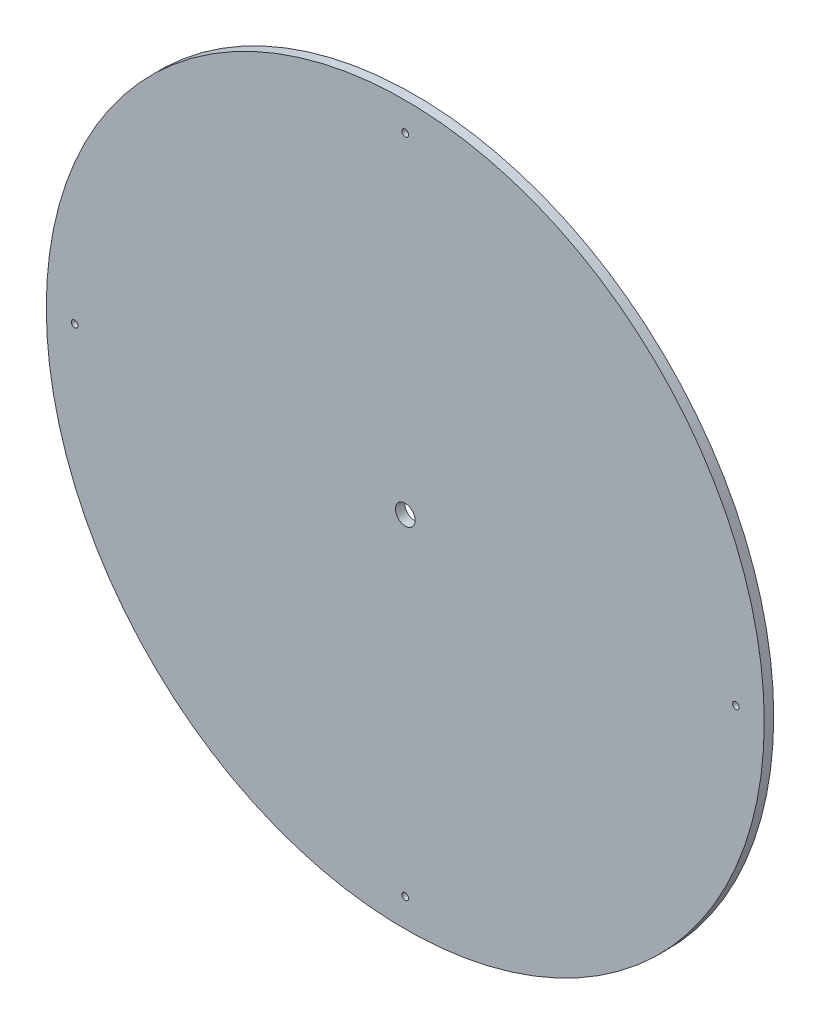
ISO-10303-21;
HEADER;
FILE_DESCRIPTION(('STEP AP214'),'2;1');
FILE_NAME('part.step','',(''),(''),'','','');
FILE_SCHEMA(('AUTOMOTIVE_DESIGN { 1 0 10303 214 1 1 1 1 }'));
ENDSEC;
DATA;
#1=APPLICATION_CONTEXT('core data for automotive mechanical design processes');
#2=APPLICATION_PROTOCOL_DEFINITION('international standard','automotive_design',2000,#1);
#3=PRODUCT_CONTEXT('',#1,'mechanical');
#4=PRODUCT('Part','Part','',(#3));
#5=PRODUCT_RELATED_PRODUCT_CATEGORY('part','',(#4));
#6=PRODUCT_DEFINITION_FORMATION('','',#4);
#7=PRODUCT_DEFINITION_CONTEXT('part definition',#1,'design');
#8=PRODUCT_DEFINITION('design','',#6,#7);
#9=PRODUCT_DEFINITION_SHAPE('','',#8);
#10=(LENGTH_UNIT() NAMED_UNIT(*) SI_UNIT(.MILLI.,.METRE.));
#11=(NAMED_UNIT(*) PLANE_ANGLE_UNIT() SI_UNIT($,.RADIAN.));
#12=(NAMED_UNIT(*) SI_UNIT($,.STERADIAN.) SOLID_ANGLE_UNIT());
#13=UNCERTAINTY_MEASURE_WITH_UNIT(LENGTH_MEASURE(1.E-05),#10,'distance_accuracy_value','');
#14=(GEOMETRIC_REPRESENTATION_CONTEXT(3) GLOBAL_UNCERTAINTY_ASSIGNED_CONTEXT((#13)) GLOBAL_UNIT_ASSIGNED_CONTEXT((#10,
#11,#12)) REPRESENTATION_CONTEXT('',''));
#15=CARTESIAN_POINT('',(0.,0.,0.));
#16=DIRECTION('',(0.,0.,1.));
#17=DIRECTION('',(1.,0.,0.));
#18=AXIS2_PLACEMENT_3D('',#15,#16,#17);
#19=CARTESIAN_POINT('',(0.,0.,12.));
#20=DIRECTION('',(0.,0.,-1.));
#21=DIRECTION('',(-1.,0.,0.));
#22=AXIS2_PLACEMENT_3D('',#19,#20,#21);
#23=CYLINDRICAL_SURFACE('',#22,455.);
#24=CARTESIAN_POINT('',(0.,0.,12.));
#25=DIRECTION('',(0.,0.,1.));
#26=DIRECTION('',(1.,0.,0.));
#27=AXIS2_PLACEMENT_3D('',#24,#25,#26);
#28=CIRCLE('',#27,455.);
#29=CARTESIAN_POINT('',(455.,0.,12.));
#30=VERTEX_POINT('',#29);
#31=EDGE_CURVE('E10',#30,#30,#28,.T.);
#32=ORIENTED_EDGE('',*,*,#31,.F.);
#33=EDGE_LOOP('',(#32));
#34=FACE_BOUND('',#33,.T.);
#35=CARTESIAN_POINT('',(0.,0.,0.));
#36=DIRECTION('',(0.,0.,1.));
#37=DIRECTION('',(1.,0.,0.));
#38=AXIS2_PLACEMENT_3D('',#35,#36,#37);
#39=CIRCLE('',#38,455.);
#40=CARTESIAN_POINT('',(455.,0.,0.));
#41=VERTEX_POINT('',#40);
#42=EDGE_CURVE('E37',#41,#41,#39,.T.);
#43=ORIENTED_EDGE('',*,*,#42,.T.);
#44=EDGE_LOOP('',(#43));
#45=FACE_BOUND('',#44,.T.);
#46=ADVANCED_FACE('F34',(#34,#45),#23,.T.);
#47=CARTESIAN_POINT('',(0.,0.,12.));
#48=DIRECTION('',(0.,0.,1.));
#49=DIRECTION('',(1.,0.,0.));
#50=AXIS2_PLACEMENT_3D('',#47,#48,#49);
#51=PLANE('',#50);
#52=CARTESIAN_POINT('',(0.,419.,12.));
#53=DIRECTION('',(0.,0.,1.));
#54=DIRECTION('',(1.,0.,0.));
#55=AXIS2_PLACEMENT_3D('',#52,#53,#54);
#56=CIRCLE('',#55,4.25);
#57=CARTESIAN_POINT('',(4.24999999999994,419.,12.));
#58=VERTEX_POINT('',#57);
#59=EDGE_CURVE('E72',#58,#58,#56,.T.);
#60=ORIENTED_EDGE('',*,*,#59,.F.);
#61=EDGE_LOOP('',(#60));
#62=FACE_BOUND('',#61,.T.);
#63=CARTESIAN_POINT('',(419.,-1.40605155956998E-13,12.));
#64=DIRECTION('',(0.,0.,1.));
#65=DIRECTION('',(1.,0.,0.));
#66=AXIS2_PLACEMENT_3D('',#63,#64,#65);
#67=CIRCLE('',#66,4.24999999999998);
#68=CARTESIAN_POINT('',(423.25,-1.40605155956998E-13,12.));
#69=VERTEX_POINT('',#68);
#70=EDGE_CURVE('E66',#69,#69,#67,.T.);
#71=ORIENTED_EDGE('',*,*,#70,.F.);
#72=EDGE_LOOP('',(#71));
#73=FACE_BOUND('',#72,.T.);
#74=CARTESIAN_POINT('',(1.07524012336669E-13,-419.,12.));
#75=DIRECTION('',(0.,0.,1.));
#76=DIRECTION('',(1.,0.,0.));
#77=AXIS2_PLACEMENT_3D('',#74,#75,#76);
#78=CIRCLE('',#77,4.25);
#79=CARTESIAN_POINT('',(4.25000000000011,-419.,12.));
#80=VERTEX_POINT('',#79);
#81=EDGE_CURVE('E60',#80,#80,#78,.T.);
#82=ORIENTED_EDGE('',*,*,#81,.F.);
#83=EDGE_LOOP('',(#82));
#84=FACE_BOUND('',#83,.T.);
#85=CARTESIAN_POINT('',(-419.,-1.40605155956998E-13,12.));
#86=DIRECTION('',(0.,0.,1.));
#87=DIRECTION('',(1.,0.,0.));
#88=AXIS2_PLACEMENT_3D('',#85,#86,#87);
#89=CIRCLE('',#88,4.24999999999998);
#90=CARTESIAN_POINT('',(-414.75,-1.40605155956998E-13,12.));
#91=VERTEX_POINT('',#90);
#92=EDGE_CURVE('E54',#91,#91,#89,.T.);
#93=ORIENTED_EDGE('',*,*,#92,.F.);
#94=EDGE_LOOP('',(#93));
#95=FACE_BOUND('',#94,.T.);
#96=CARTESIAN_POINT('',(0.,0.,12.));
#97=DIRECTION('',(0.,0.,1.));
#98=DIRECTION('',(1.,0.,0.));
#99=AXIS2_PLACEMENT_3D('',#96,#97,#98);
#100=CIRCLE('',#99,12.5);
#101=CARTESIAN_POINT('',(12.5,0.,12.));
#102=VERTEX_POINT('',#101);
#103=EDGE_CURVE('E46',#102,#102,#100,.T.);
#104=ORIENTED_EDGE('',*,*,#103,.F.);
#105=EDGE_LOOP('',(#104));
#106=FACE_BOUND('',#105,.T.);
#107=ORIENTED_EDGE('',*,*,#31,.T.);
#108=EDGE_LOOP('',(#107));
#109=FACE_BOUND('',#108,.T.);
#110=ADVANCED_FACE('F78',(#62,#73,#84,#95,#106,#109),#51,.T.);
#111=CARTESIAN_POINT('',(0.,0.,0.));
#112=DIRECTION('',(0.,0.,1.));
#113=DIRECTION('',(1.,0.,0.));
#114=AXIS2_PLACEMENT_3D('',#111,#112,#113);
#115=PLANE('',#114);
#116=CARTESIAN_POINT('',(0.,419.,0.));
#117=DIRECTION('',(0.,0.,1.));
#118=DIRECTION('',(1.,0.,0.));
#119=AXIS2_PLACEMENT_3D('',#116,#117,#118);
#120=CIRCLE('',#119,4.25);
#121=CARTESIAN_POINT('',(4.24999999999994,419.,0.));
#122=VERTEX_POINT('',#121);
#123=EDGE_CURVE('E69',#122,#122,#120,.T.);
#124=ORIENTED_EDGE('',*,*,#123,.T.);
#125=EDGE_LOOP('',(#124));
#126=FACE_BOUND('',#125,.T.);
#127=CARTESIAN_POINT('',(419.,-1.40605155956998E-13,0.));
#128=DIRECTION('',(0.,0.,1.));
#129=DIRECTION('',(1.,0.,0.));
#130=AXIS2_PLACEMENT_3D('',#127,#128,#129);
#131=CIRCLE('',#130,4.24999999999998);
#132=CARTESIAN_POINT('',(423.25,-1.40605155956998E-13,0.));
#133=VERTEX_POINT('',#132);
#134=EDGE_CURVE('E63',#133,#133,#131,.T.);
#135=ORIENTED_EDGE('',*,*,#134,.T.);
#136=EDGE_LOOP('',(#135));
#137=FACE_BOUND('',#136,.T.);
#138=CARTESIAN_POINT('',(1.07524012336669E-13,-419.,0.));
#139=DIRECTION('',(0.,0.,1.));
#140=DIRECTION('',(1.,0.,0.));
#141=AXIS2_PLACEMENT_3D('',#138,#139,#140);
#142=CIRCLE('',#141,4.25);
#143=CARTESIAN_POINT('',(4.25000000000011,-419.,0.));
#144=VERTEX_POINT('',#143);
#145=EDGE_CURVE('E57',#144,#144,#142,.T.);
#146=ORIENTED_EDGE('',*,*,#145,.T.);
#147=EDGE_LOOP('',(#146));
#148=FACE_BOUND('',#147,.T.);
#149=CARTESIAN_POINT('',(-419.,-1.40605155956998E-13,0.));
#150=DIRECTION('',(0.,0.,1.));
#151=DIRECTION('',(1.,0.,0.));
#152=AXIS2_PLACEMENT_3D('',#149,#150,#151);
#153=CIRCLE('',#152,4.24999999999998);
#154=CARTESIAN_POINT('',(-414.75,-1.40605155956998E-13,0.));
#155=VERTEX_POINT('',#154);
#156=EDGE_CURVE('E49',#155,#155,#153,.T.);
#157=ORIENTED_EDGE('',*,*,#156,.T.);
#158=EDGE_LOOP('',(#157));
#159=FACE_BOUND('',#158,.T.);
#160=CARTESIAN_POINT('',(0.,0.,0.));
#161=DIRECTION('',(0.,0.,1.));
#162=DIRECTION('',(1.,0.,0.));
#163=AXIS2_PLACEMENT_3D('',#160,#161,#162);
#164=CIRCLE('',#163,12.5);
#165=CARTESIAN_POINT('',(12.5,0.,0.));
#166=VERTEX_POINT('',#165);
#167=EDGE_CURVE('E44',#166,#166,#164,.T.);
#168=ORIENTED_EDGE('',*,*,#167,.T.);
#169=EDGE_LOOP('',(#168));
#170=FACE_BOUND('',#169,.T.);
#171=ORIENTED_EDGE('',*,*,#42,.F.);
#172=EDGE_LOOP('',(#171));
#173=FACE_BOUND('',#172,.T.);
#174=ADVANCED_FACE('F81',(#126,#137,#148,#159,#170,#173),#115,.F.);
#175=CARTESIAN_POINT('',(0.,0.,0.));
#176=DIRECTION('',(0.,0.,1.));
#177=DIRECTION('',(1.,0.,0.));
#178=AXIS2_PLACEMENT_3D('',#175,#176,#177);
#179=CYLINDRICAL_SURFACE('',#178,12.5);
#180=ORIENTED_EDGE('',*,*,#167,.F.);
#181=EDGE_LOOP('',(#180));
#182=FACE_BOUND('',#181,.T.);
#183=ORIENTED_EDGE('',*,*,#103,.T.);
#184=EDGE_LOOP('',(#183));
#185=FACE_BOUND('',#184,.T.);
#186=ADVANCED_FACE('F91',(#182,#185),#179,.F.);
#187=CARTESIAN_POINT('',(-419.,-1.40605155956998E-13,12.));
#188=DIRECTION('',(0.,0.,1.));
#189=DIRECTION('',(1.,0.,0.));
#190=AXIS2_PLACEMENT_3D('',#187,#188,#189);
#191=CYLINDRICAL_SURFACE('',#190,4.24999999999998);
#192=ORIENTED_EDGE('',*,*,#156,.F.);
#193=EDGE_LOOP('',(#192));
#194=FACE_BOUND('',#193,.T.);
#195=ORIENTED_EDGE('',*,*,#92,.T.);
#196=EDGE_LOOP('',(#195));
#197=FACE_BOUND('',#196,.T.);
#198=ADVANCED_FACE('F93',(#194,#197),#191,.F.);
#199=CARTESIAN_POINT('',(1.07524012336669E-13,-419.,12.));
#200=DIRECTION('',(0.,0.,1.));
#201=DIRECTION('',(1.,0.,0.));
#202=AXIS2_PLACEMENT_3D('',#199,#200,#201);
#203=CYLINDRICAL_SURFACE('',#202,4.25);
#204=ORIENTED_EDGE('',*,*,#145,.F.);
#205=EDGE_LOOP('',(#204));
#206=FACE_BOUND('',#205,.T.);
#207=ORIENTED_EDGE('',*,*,#81,.T.);
#208=EDGE_LOOP('',(#207));
#209=FACE_BOUND('',#208,.T.);
#210=ADVANCED_FACE('F100',(#206,#209),#203,.F.);
#211=CARTESIAN_POINT('',(419.,-1.40605155956998E-13,12.));
#212=DIRECTION('',(0.,0.,1.));
#213=DIRECTION('',(1.,0.,0.));
#214=AXIS2_PLACEMENT_3D('',#211,#212,#213);
#215=CYLINDRICAL_SURFACE('',#214,4.24999999999998);
#216=ORIENTED_EDGE('',*,*,#134,.F.);
#217=EDGE_LOOP('',(#216));
#218=FACE_BOUND('',#217,.T.);
#219=ORIENTED_EDGE('',*,*,#70,.T.);
#220=EDGE_LOOP('',(#219));
#221=FACE_BOUND('',#220,.T.);
#222=ADVANCED_FACE('F136',(#218,#221),#215,.F.);
#223=CARTESIAN_POINT('',(0.,419.,12.));
#224=DIRECTION('',(0.,0.,1.));
#225=DIRECTION('',(1.,0.,0.));
#226=AXIS2_PLACEMENT_3D('',#223,#224,#225);
#227=CYLINDRICAL_SURFACE('',#226,4.25);
#228=ORIENTED_EDGE('',*,*,#123,.F.);
#229=EDGE_LOOP('',(#228));
#230=FACE_BOUND('',#229,.T.);
#231=ORIENTED_EDGE('',*,*,#59,.T.);
#232=EDGE_LOOP('',(#231));
#233=FACE_BOUND('',#232,.T.);
#234=ADVANCED_FACE('F76',(#230,#233),#227,.F.);
#235=CLOSED_SHELL('',(#46,#110,#174,#186,#198,#210,#222,#234));
#236=MANIFOLD_SOLID_BREP('B2',#235);
#237=ADVANCED_BREP_SHAPE_REPRESENTATION('',(#18,#236),#14);
#238=SHAPE_DEFINITION_REPRESENTATION(#9,#237);
ENDSEC;
END-ISO-10303-21;
